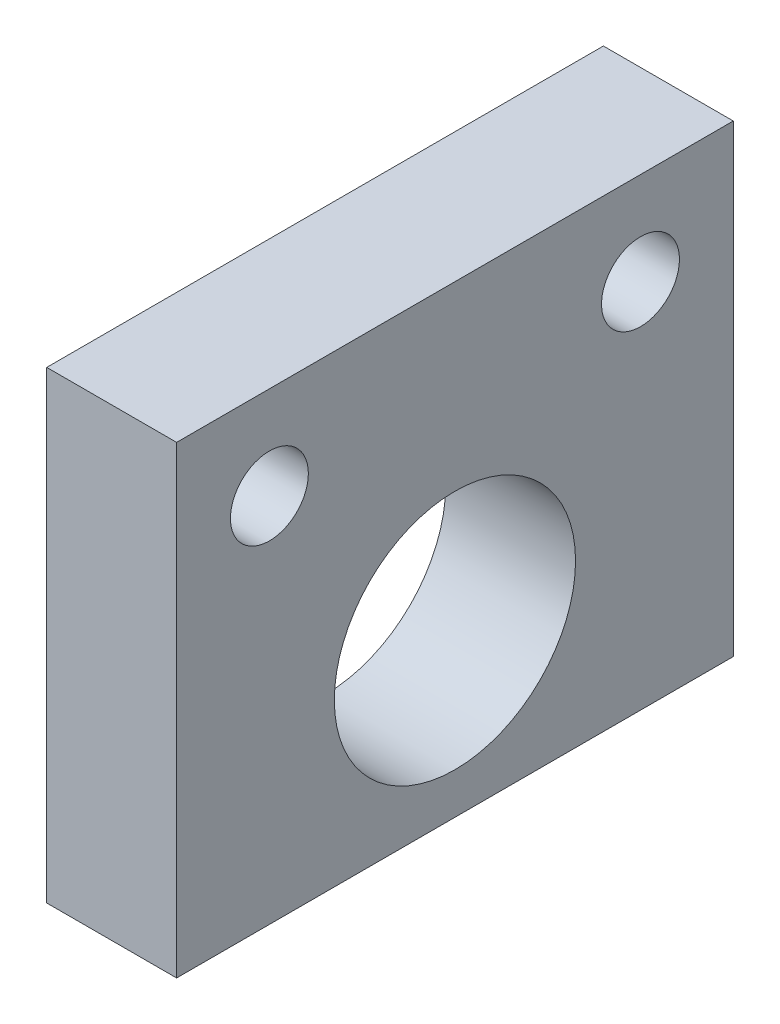
ISO-10303-21;
HEADER;
FILE_DESCRIPTION(('STEP AP214'),'2;1');
FILE_NAME('part.step','',(''),(''),'','','');
FILE_SCHEMA(('AUTOMOTIVE_DESIGN { 1 0 10303 214 1 1 1 1 }'));
ENDSEC;
DATA;
#1=APPLICATION_CONTEXT('core data for automotive mechanical design processes');
#2=APPLICATION_PROTOCOL_DEFINITION('international standard','automotive_design',2000,#1);
#3=PRODUCT_CONTEXT('',#1,'mechanical');
#4=PRODUCT('Part','Part','',(#3));
#5=PRODUCT_RELATED_PRODUCT_CATEGORY('part','',(#4));
#6=PRODUCT_DEFINITION_FORMATION('','',#4);
#7=PRODUCT_DEFINITION_CONTEXT('part definition',#1,'design');
#8=PRODUCT_DEFINITION('design','',#6,#7);
#9=PRODUCT_DEFINITION_SHAPE('','',#8);
#10=(LENGTH_UNIT() NAMED_UNIT(*) SI_UNIT(.MILLI.,.METRE.));
#11=(NAMED_UNIT(*) PLANE_ANGLE_UNIT() SI_UNIT($,.RADIAN.));
#12=(NAMED_UNIT(*) SI_UNIT($,.STERADIAN.) SOLID_ANGLE_UNIT());
#13=UNCERTAINTY_MEASURE_WITH_UNIT(LENGTH_MEASURE(1.E-05),#10,'distance_accuracy_value','');
#14=(GEOMETRIC_REPRESENTATION_CONTEXT(3) GLOBAL_UNCERTAINTY_ASSIGNED_CONTEXT((#13)) GLOBAL_UNIT_ASSIGNED_CONTEXT((#10,
#11,#12)) REPRESENTATION_CONTEXT('',''));
#15=CARTESIAN_POINT('',(0.,0.,0.));
#16=DIRECTION('',(0.,0.,1.));
#17=DIRECTION('',(1.,0.,0.));
#18=AXIS2_PLACEMENT_3D('',#15,#16,#17);
#19=CARTESIAN_POINT('',(3.5,25.,15.));
#20=DIRECTION('',(-1.,0.,0.));
#21=DIRECTION('',(0.,0.,1.));
#22=AXIS2_PLACEMENT_3D('',#19,#20,#21);
#23=PLANE('',#22);
#24=CARTESIAN_POINT('',(3.5,20.,10.));
#25=DIRECTION('',(1.,0.,0.));
#26=DIRECTION('',(0.,0.,-1.));
#27=AXIS2_PLACEMENT_3D('',#24,#25,#26);
#28=CIRCLE('',#27,2.1);
#29=CARTESIAN_POINT('',(3.5,20.,7.90000000000001));
#30=VERTEX_POINT('',#29);
#31=EDGE_CURVE('E156',#30,#30,#28,.T.);
#32=ORIENTED_EDGE('',*,*,#31,.F.);
#33=EDGE_LOOP('',(#32));
#34=FACE_BOUND('',#33,.T.);
#35=CARTESIAN_POINT('',(3.5,20.,-10.));
#36=DIRECTION('',(1.,0.,0.));
#37=DIRECTION('',(0.,0.,-1.));
#38=AXIS2_PLACEMENT_3D('',#35,#36,#37);
#39=CIRCLE('',#38,2.1);
#40=CARTESIAN_POINT('',(3.5,20.,-12.1));
#41=VERTEX_POINT('',#40);
#42=EDGE_CURVE('E148',#41,#41,#39,.T.);
#43=ORIENTED_EDGE('',*,*,#42,.F.);
#44=EDGE_LOOP('',(#43));
#45=FACE_BOUND('',#44,.T.);
#46=CARTESIAN_POINT('',(3.5,8.72,0.));
#47=DIRECTION('',(1.,0.,0.));
#48=DIRECTION('',(0.,0.,-1.));
#49=AXIS2_PLACEMENT_3D('',#46,#47,#48);
#50=CIRCLE('',#49,6.5);
#51=CARTESIAN_POINT('',(3.5,8.72,-6.5));
#52=VERTEX_POINT('',#51);
#53=EDGE_CURVE('E140',#52,#52,#50,.T.);
#54=ORIENTED_EDGE('',*,*,#53,.F.);
#55=EDGE_LOOP('',(#54));
#56=FACE_BOUND('',#55,.T.);
#57=DIRECTION('',(0.,0.,-1.));
#58=VECTOR('',#57,1.);
#59=CARTESIAN_POINT('',(3.5,0.,15.));
#60=LINE('',#59,#58);
#61=CARTESIAN_POINT('',(3.5,0.,15.));
#62=VERTEX_POINT('',#61);
#63=CARTESIAN_POINT('',(3.5,0.,-15.));
#64=VERTEX_POINT('',#63);
#65=EDGE_CURVE('E116',#62,#64,#60,.T.);
#66=ORIENTED_EDGE('',*,*,#65,.T.);
#67=DIRECTION('',(0.,-1.,0.));
#68=VECTOR('',#67,1.);
#69=CARTESIAN_POINT('',(3.5,25.,-15.));
#70=LINE('',#69,#68);
#71=CARTESIAN_POINT('',(3.5,25.,-15.));
#72=VERTEX_POINT('',#71);
#73=EDGE_CURVE('E11',#72,#64,#70,.T.);
#74=ORIENTED_EDGE('',*,*,#73,.F.);
#75=DIRECTION('',(0.,0.,-1.));
#76=VECTOR('',#75,1.);
#77=CARTESIAN_POINT('',(3.5,25.,15.));
#78=LINE('',#77,#76);
#79=CARTESIAN_POINT('',(3.5,25.,15.));
#80=VERTEX_POINT('',#79);
#81=EDGE_CURVE('E100',#80,#72,#78,.T.);
#82=ORIENTED_EDGE('',*,*,#81,.F.);
#83=DIRECTION('',(0.,-1.,0.));
#84=VECTOR('',#83,1.);
#85=CARTESIAN_POINT('',(3.5,25.,15.));
#86=LINE('',#85,#84);
#87=EDGE_CURVE('E112',#80,#62,#86,.T.);
#88=ORIENTED_EDGE('',*,*,#87,.T.);
#89=EDGE_LOOP('',(#66,#74,#82,#88));
#90=FACE_BOUND('',#89,.T.);
#91=ADVANCED_FACE('F48',(#34,#45,#56,#90),#23,.F.);
#92=CARTESIAN_POINT('',(-3.5,25.,-15.));
#93=DIRECTION('',(0.,0.,1.));
#94=DIRECTION('',(1.,0.,0.));
#95=AXIS2_PLACEMENT_3D('',#92,#93,#94);
#96=PLANE('',#95);
#97=DIRECTION('',(-1.,0.,0.));
#98=VECTOR('',#97,1.);
#99=CARTESIAN_POINT('',(-3.5,0.,-15.));
#100=LINE('',#99,#98);
#101=CARTESIAN_POINT('',(-3.5,0.,-15.));
#102=VERTEX_POINT('',#101);
#103=EDGE_CURVE('E105',#64,#102,#100,.T.);
#104=ORIENTED_EDGE('',*,*,#103,.T.);
#105=DIRECTION('',(0.,-1.,0.));
#106=VECTOR('',#105,1.);
#107=CARTESIAN_POINT('',(-3.5,25.,-15.));
#108=LINE('',#107,#106);
#109=CARTESIAN_POINT('',(-3.5,25.,-15.));
#110=VERTEX_POINT('',#109);
#111=EDGE_CURVE('E57',#110,#102,#108,.T.);
#112=ORIENTED_EDGE('',*,*,#111,.F.);
#113=DIRECTION('',(-1.,0.,0.));
#114=VECTOR('',#113,1.);
#115=CARTESIAN_POINT('',(-3.5,25.,-15.));
#116=LINE('',#115,#114);
#117=EDGE_CURVE('E95',#72,#110,#116,.T.);
#118=ORIENTED_EDGE('',*,*,#117,.F.);
#119=ORIENTED_EDGE('',*,*,#73,.T.);
#120=EDGE_LOOP('',(#104,#112,#118,#119));
#121=FACE_BOUND('',#120,.T.);
#122=ADVANCED_FACE('F104',(#121),#96,.F.);
#123=CARTESIAN_POINT('',(-3.5,25.,15.));
#124=DIRECTION('',(1.,0.,0.));
#125=DIRECTION('',(0.,0.,-1.));
#126=AXIS2_PLACEMENT_3D('',#123,#124,#125);
#127=PLANE('',#126);
#128=CARTESIAN_POINT('',(-3.5,20.,10.));
#129=DIRECTION('',(1.,0.,0.));
#130=DIRECTION('',(0.,0.,-1.));
#131=AXIS2_PLACEMENT_3D('',#128,#129,#130);
#132=CIRCLE('',#131,2.1);
#133=CARTESIAN_POINT('',(-3.5,20.,7.90000000000001));
#134=VERTEX_POINT('',#133);
#135=EDGE_CURVE('E152',#134,#134,#132,.T.);
#136=ORIENTED_EDGE('',*,*,#135,.T.);
#137=EDGE_LOOP('',(#136));
#138=FACE_BOUND('',#137,.T.);
#139=CARTESIAN_POINT('',(-3.5,20.,-10.));
#140=DIRECTION('',(1.,0.,0.));
#141=DIRECTION('',(0.,0.,-1.));
#142=AXIS2_PLACEMENT_3D('',#139,#140,#141);
#143=CIRCLE('',#142,2.1);
#144=CARTESIAN_POINT('',(-3.5,20.,-12.1));
#145=VERTEX_POINT('',#144);
#146=EDGE_CURVE('E144',#145,#145,#143,.T.);
#147=ORIENTED_EDGE('',*,*,#146,.T.);
#148=EDGE_LOOP('',(#147));
#149=FACE_BOUND('',#148,.T.);
#150=CARTESIAN_POINT('',(-3.5,8.72,0.));
#151=DIRECTION('',(1.,0.,0.));
#152=DIRECTION('',(0.,0.,-1.));
#153=AXIS2_PLACEMENT_3D('',#150,#151,#152);
#154=CIRCLE('',#153,6.5);
#155=CARTESIAN_POINT('',(-3.5,8.72,-6.5));
#156=VERTEX_POINT('',#155);
#157=EDGE_CURVE('E120',#156,#156,#154,.F.);
#158=ORIENTED_EDGE('',*,*,#157,.F.);
#159=EDGE_LOOP('',(#158));
#160=FACE_BOUND('',#159,.T.);
#161=DIRECTION('',(0.,0.,1.));
#162=VECTOR('',#161,1.);
#163=CARTESIAN_POINT('',(-3.5,0.,15.));
#164=LINE('',#163,#162);
#165=CARTESIAN_POINT('',(-3.5,0.,15.));
#166=VERTEX_POINT('',#165);
#167=EDGE_CURVE('E82',#102,#166,#164,.T.);
#168=ORIENTED_EDGE('',*,*,#167,.T.);
#169=DIRECTION('',(0.,-1.,0.));
#170=VECTOR('',#169,1.);
#171=CARTESIAN_POINT('',(-3.5,25.,15.));
#172=LINE('',#171,#170);
#173=CARTESIAN_POINT('',(-3.5,25.,15.));
#174=VERTEX_POINT('',#173);
#175=EDGE_CURVE('E107',#174,#166,#172,.T.);
#176=ORIENTED_EDGE('',*,*,#175,.F.);
#177=DIRECTION('',(0.,0.,1.));
#178=VECTOR('',#177,1.);
#179=CARTESIAN_POINT('',(-3.5,25.,15.));
#180=LINE('',#179,#178);
#181=EDGE_CURVE('E98',#110,#174,#180,.T.);
#182=ORIENTED_EDGE('',*,*,#181,.F.);
#183=ORIENTED_EDGE('',*,*,#111,.T.);
#184=EDGE_LOOP('',(#168,#176,#182,#183));
#185=FACE_BOUND('',#184,.T.);
#186=ADVANCED_FACE('F108',(#138,#149,#160,#185),#127,.F.);
#187=CARTESIAN_POINT('',(-3.5,25.,15.));
#188=DIRECTION('',(0.,0.,-1.));
#189=DIRECTION('',(-1.,0.,0.));
#190=AXIS2_PLACEMENT_3D('',#187,#188,#189);
#191=PLANE('',#190);
#192=DIRECTION('',(1.,0.,0.));
#193=VECTOR('',#192,1.);
#194=CARTESIAN_POINT('',(-3.5,0.,15.));
#195=LINE('',#194,#193);
#196=EDGE_CURVE('E88',#166,#62,#195,.T.);
#197=ORIENTED_EDGE('',*,*,#196,.T.);
#198=ORIENTED_EDGE('',*,*,#87,.F.);
#199=DIRECTION('',(1.,0.,0.));
#200=VECTOR('',#199,1.);
#201=CARTESIAN_POINT('',(-3.5,25.,15.));
#202=LINE('',#201,#200);
#203=EDGE_CURVE('E65',#174,#80,#202,.T.);
#204=ORIENTED_EDGE('',*,*,#203,.F.);
#205=ORIENTED_EDGE('',*,*,#175,.T.);
#206=EDGE_LOOP('',(#197,#198,#204,#205));
#207=FACE_BOUND('',#206,.T.);
#208=ADVANCED_FACE('F130',(#207),#191,.F.);
#209=CARTESIAN_POINT('',(0.,25.,0.));
#210=DIRECTION('',(0.,-1.,0.));
#211=DIRECTION('',(0.,0.,-1.));
#212=AXIS2_PLACEMENT_3D('',#209,#210,#211);
#213=PLANE('',#212);
#214=ORIENTED_EDGE('',*,*,#81,.T.);
#215=ORIENTED_EDGE('',*,*,#117,.T.);
#216=ORIENTED_EDGE('',*,*,#181,.T.);
#217=ORIENTED_EDGE('',*,*,#203,.T.);
#218=EDGE_LOOP('',(#214,#215,#216,#217));
#219=FACE_BOUND('',#218,.T.);
#220=ADVANCED_FACE('F96',(#219),#213,.F.);
#221=CARTESIAN_POINT('',(0.,0.,0.));
#222=DIRECTION('',(0.,-1.,0.));
#223=DIRECTION('',(0.,0.,-1.));
#224=AXIS2_PLACEMENT_3D('',#221,#222,#223);
#225=PLANE('',#224);
#226=ORIENTED_EDGE('',*,*,#65,.F.);
#227=ORIENTED_EDGE('',*,*,#196,.F.);
#228=ORIENTED_EDGE('',*,*,#167,.F.);
#229=ORIENTED_EDGE('',*,*,#103,.F.);
#230=EDGE_LOOP('',(#226,#227,#228,#229));
#231=FACE_BOUND('',#230,.T.);
#232=ADVANCED_FACE('F133',(#231),#225,.T.);
#233=CARTESIAN_POINT('',(-21.8847763108502,8.72,0.));
#234=DIRECTION('',(1.,0.,0.));
#235=DIRECTION('',(0.,0.,-1.));
#236=AXIS2_PLACEMENT_3D('',#233,#234,#235);
#237=CYLINDRICAL_SURFACE('',#236,6.5);
#238=ORIENTED_EDGE('',*,*,#157,.T.);
#239=EDGE_LOOP('',(#238));
#240=FACE_BOUND('',#239,.T.);
#241=ORIENTED_EDGE('',*,*,#53,.T.);
#242=EDGE_LOOP('',(#241));
#243=FACE_BOUND('',#242,.T.);
#244=ADVANCED_FACE('F169',(#240,#243),#237,.F.);
#245=CARTESIAN_POINT('',(3.5,20.,-10.));
#246=DIRECTION('',(1.,0.,0.));
#247=DIRECTION('',(0.,0.,-1.));
#248=AXIS2_PLACEMENT_3D('',#245,#246,#247);
#249=CYLINDRICAL_SURFACE('',#248,2.1);
#250=ORIENTED_EDGE('',*,*,#146,.F.);
#251=EDGE_LOOP('',(#250));
#252=FACE_BOUND('',#251,.T.);
#253=ORIENTED_EDGE('',*,*,#42,.T.);
#254=EDGE_LOOP('',(#253));
#255=FACE_BOUND('',#254,.T.);
#256=ADVANCED_FACE('F171',(#252,#255),#249,.F.);
#257=CARTESIAN_POINT('',(3.5,20.,10.));
#258=DIRECTION('',(1.,0.,0.));
#259=DIRECTION('',(0.,0.,-1.));
#260=AXIS2_PLACEMENT_3D('',#257,#258,#259);
#261=CYLINDRICAL_SURFACE('',#260,2.1);
#262=ORIENTED_EDGE('',*,*,#135,.F.);
#263=EDGE_LOOP('',(#262));
#264=FACE_BOUND('',#263,.T.);
#265=ORIENTED_EDGE('',*,*,#31,.T.);
#266=EDGE_LOOP('',(#265));
#267=FACE_BOUND('',#266,.T.);
#268=ADVANCED_FACE('F161',(#264,#267),#261,.F.);
#269=CLOSED_SHELL('',(#91,#122,#186,#208,#220,#232,#244,#256,#268));
#270=MANIFOLD_SOLID_BREP('B2',#269);
#271=ADVANCED_BREP_SHAPE_REPRESENTATION('',(#18,#270),#14);
#272=SHAPE_DEFINITION_REPRESENTATION(#9,#271);
ENDSEC;
END-ISO-10303-21;
